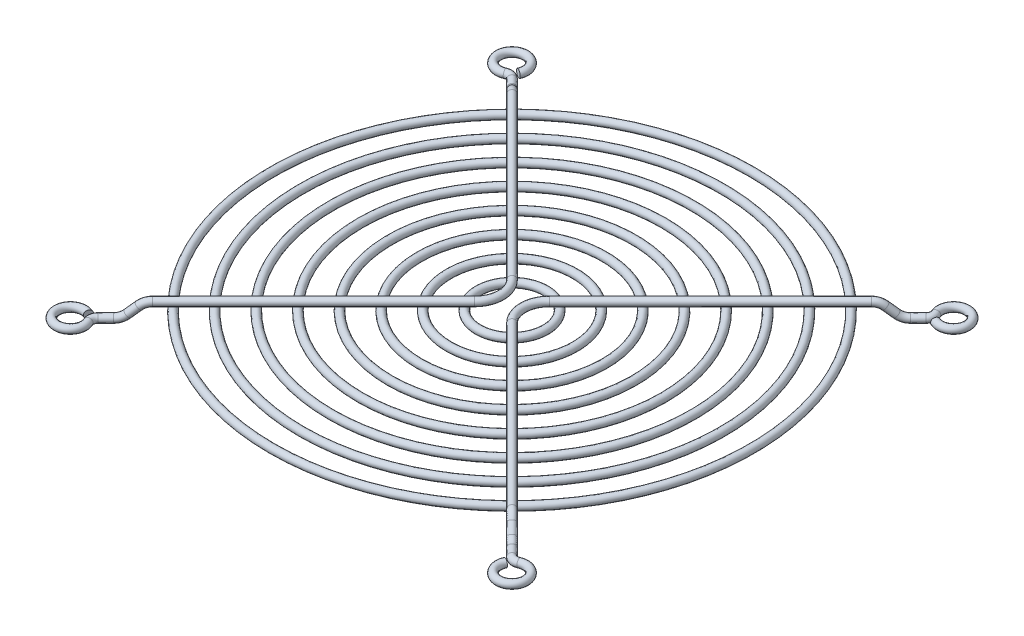
ISO-10303-21;
HEADER;
FILE_DESCRIPTION(('STEP AP214'),'2;1');
FILE_NAME('part.step','',(''),(''),'','','');
FILE_SCHEMA(('AUTOMOTIVE_DESIGN { 1 0 10303 214 1 1 1 1 }'));
ENDSEC;
DATA;
#1=APPLICATION_CONTEXT('core data for automotive mechanical design processes');
#2=APPLICATION_PROTOCOL_DEFINITION('international standard','automotive_design',2000,#1);
#3=PRODUCT_CONTEXT('',#1,'mechanical');
#4=PRODUCT('Part','Part','',(#3));
#5=PRODUCT_RELATED_PRODUCT_CATEGORY('part','',(#4));
#6=PRODUCT_DEFINITION_FORMATION('','',#4);
#7=PRODUCT_DEFINITION_CONTEXT('part definition',#1,'design');
#8=PRODUCT_DEFINITION('design','',#6,#7);
#9=PRODUCT_DEFINITION_SHAPE('','',#8);
#10=(LENGTH_UNIT() NAMED_UNIT(*) SI_UNIT(.MILLI.,.METRE.));
#11=(NAMED_UNIT(*) PLANE_ANGLE_UNIT() SI_UNIT($,.RADIAN.));
#12=(NAMED_UNIT(*) SI_UNIT($,.STERADIAN.) SOLID_ANGLE_UNIT());
#13=UNCERTAINTY_MEASURE_WITH_UNIT(LENGTH_MEASURE(1.E-05),#10,'distance_accuracy_value','');
#14=(GEOMETRIC_REPRESENTATION_CONTEXT(3) GLOBAL_UNCERTAINTY_ASSIGNED_CONTEXT((#13)) GLOBAL_UNIT_ASSIGNED_CONTEXT((#10,
#11,#12)) REPRESENTATION_CONTEXT('',''));
#15=CARTESIAN_POINT('',(0.,0.,0.));
#16=DIRECTION('',(0.,0.,1.));
#17=DIRECTION('',(1.,0.,0.));
#18=AXIS2_PLACEMENT_3D('',#15,#16,#17);
#19=CARTESIAN_POINT('',(4.43847763108502,4.6,4.43847763108508));
#20=DIRECTION('',(0.707106781186544,0.,0.707106781186551));
#21=DIRECTION('',(0.707106781186551,0.,-0.707106781186544));
#22=AXIS2_PLACEMENT_3D('',#19,#20,#21);
#23=CYLINDRICAL_SURFACE('',#22,0.9);
#24=CARTESIAN_POINT('',(4.43847763108502,4.6,4.43847763108508));
#25=DIRECTION('',(-0.707106781186542,0.,-0.707106781186553));
#26=DIRECTION('',(-0.707106781186553,0.,0.707106781186542));
#27=AXIS2_PLACEMENT_3D('',#24,#25,#26);
#28=CIRCLE('',#27,0.9);
#29=CARTESIAN_POINT('',(3.80208152801713,4.6,5.07487373415296));
#30=VERTEX_POINT('',#29);
#31=EDGE_CURVE('E11',#30,#30,#28,.T.);
#32=ORIENTED_EDGE('',*,*,#31,.F.);
#33=EDGE_LOOP('',(#32));
#34=FACE_BOUND('',#33,.T.);
#35=CARTESIAN_POINT('',(42.6385389055486,4.6,42.638538905549));
#36=DIRECTION('',(0.707106781186543,0.,0.707106781186552));
#37=DIRECTION('',(0.707106781186552,0.,-0.707106781186543));
#38=AXIS2_PLACEMENT_3D('',#35,#36,#37);
#39=CIRCLE('',#38,0.899999999999832);
#40=CARTESIAN_POINT('',(42.6385389055486,5.49999999999982,42.638538905549));
#41=VERTEX_POINT('',#40);
#42=EDGE_CURVE('E75',#41,#41,#39,.T.);
#43=ORIENTED_EDGE('',*,*,#42,.F.);
#44=EDGE_LOOP('',(#43));
#45=FACE_BOUND('',#44,.T.);
#46=ADVANCED_FACE('F50',(#34,#45),#23,.T.);
#47=CARTESIAN_POINT('',(47.3088311754566,4.8,47.3088311754571));
#48=DIRECTION('',(-0.707106781186546,0.,0.707106781186549));
#49=DIRECTION('',(0.707106781186549,0.,0.707106781186546));
#50=AXIS2_PLACEMENT_3D('',#47,#48,#49);
#51=TOROIDAL_SURFACE('',#50,3.60000000000001,0.899999999999832);
#52=CARTESIAN_POINT('',(45.6395705728697,2.08207099406508,45.6395705728702));
#53=DIRECTION('',(0.533851675244496,-0.655747495364855,0.533851675244505));
#54=DIRECTION('',(0.70710678118655,0.,-0.707106781186545));
#55=AXIS2_PLACEMENT_3D('',#52,#53,#54);
#56=CIRCLE('',#55,0.899999999999832);
#57=CARTESIAN_POINT('',(45.2222554222231,1.40258874258148,45.2222554222235));
#58=VERTEX_POINT('',#57);
#59=EDGE_CURVE('E63',#58,#58,#56,.T.);
#60=CARTESIAN_POINT('',(47.3088311754566,1.19999999999999,47.3088311754571));
#61=DIRECTION('',(0.707106781186544,0.,0.707106781186552));
#62=DIRECTION('',(0.707106781186552,0.,-0.707106781186543));
#63=AXIS2_PLACEMENT_3D('',#60,#61,#62);
#64=CIRCLE('',#63,0.899999999999832);
#65=CARTESIAN_POINT('',(47.3088311754566,0.300000000000154,47.308831175457));
#66=VERTEX_POINT('',#65);
#67=EDGE_CURVE('E57',#66,#66,#64,.T.);
#68=CARTESIAN_POINT('',(47.3088311754566,4.8,47.3088311754571));
#69=DIRECTION('',(-0.707106781186546,0.,0.707106781186549));
#70=DIRECTION('',(0.707106781186549,0.,0.707106781186546));
#71=AXIS2_PLACEMENT_3D('',#68,#69,#70);
#72=CIRCLE('',#71,4.49999999999984);
#73=EDGE_CURVE('',#58,#66,#72,.T.);
#74=ORIENTED_EDGE('',*,*,#59,.T.);
#75=ORIENTED_EDGE('',*,*,#67,.F.);
#76=ORIENTED_EDGE('',*,*,#73,.T.);
#77=ORIENTED_EDGE('',*,*,#73,.F.);
#78=EDGE_LOOP('',(#74,#76,#75,#77));
#79=FACE_BOUND('',#78,.T.);
#80=ADVANCED_FACE('F152',(#79),#51,.T.);
#81=CARTESIAN_POINT('',(44.3077995081355,3.71792900593494,44.3077995081359));
#82=DIRECTION('',(0.533851675244502,-0.655747495364855,0.533851675244499));
#83=DIRECTION('',(-0.775501949808318,-0.631345171711558,0.));
#84=AXIS2_PLACEMENT_3D('',#81,#82,#83);
#85=CYLINDRICAL_SURFACE('',#84,0.899999999999832);
#86=CARTESIAN_POINT('',(44.3077995081355,3.71792900593494,44.3077995081359));
#87=DIRECTION('',(0.533851675244496,-0.655747495364855,0.533851675244505));
#88=DIRECTION('',(0.70710678118655,0.,-0.707106781186545));
#89=AXIS2_PLACEMENT_3D('',#86,#87,#88);
#90=CIRCLE('',#89,0.899999999999832);
#91=CARTESIAN_POINT('',(44.7251146587821,4.39741125741854,44.7251146587826));
#92=VERTEX_POINT('',#91);
#93=EDGE_CURVE('E69',#92,#92,#90,.T.);
#94=ORIENTED_EDGE('',*,*,#93,.T.);
#95=EDGE_LOOP('',(#94));
#96=FACE_BOUND('',#95,.T.);
#97=ORIENTED_EDGE('',*,*,#59,.F.);
#98=EDGE_LOOP('',(#97));
#99=FACE_BOUND('',#98,.T.);
#100=ADVANCED_FACE('F157',(#96,#99),#85,.T.);
#101=CARTESIAN_POINT('',(42.6385389055486,1.,42.638538905549));
#102=DIRECTION('',(-0.707106781186546,0.,0.707106781186549));
#103=DIRECTION('',(0.707106781186549,0.,0.707106781186546));
#104=AXIS2_PLACEMENT_3D('',#101,#102,#103);
#105=TOROIDAL_SURFACE('',#104,3.59999999999999,0.899999999999832);
#106=CARTESIAN_POINT('',(42.6385389055486,1.,42.638538905549));
#107=DIRECTION('',(-0.707106781186546,0.,0.707106781186549));
#108=DIRECTION('',(0.707106781186549,0.,0.707106781186546));
#109=AXIS2_PLACEMENT_3D('',#106,#107,#108);
#110=CIRCLE('',#109,4.49999999999982);
#111=EDGE_CURVE('',#92,#41,#110,.T.);
#112=ORIENTED_EDGE('',*,*,#93,.F.);
#113=ORIENTED_EDGE('',*,*,#42,.T.);
#114=ORIENTED_EDGE('',*,*,#111,.T.);
#115=ORIENTED_EDGE('',*,*,#111,.F.);
#116=EDGE_LOOP('',(#112,#114,#113,#115));
#117=FACE_BOUND('',#116,.T.);
#118=ADVANCED_FACE('F162',(#117),#105,.T.);
#119=CARTESIAN_POINT('',(52.3999999999997,1.19999999999999,52.4000000000003));
#120=DIRECTION('',(0.,-1.,0.));
#121=DIRECTION('',(0.,0.,1.));
#122=AXIS2_PLACEMENT_3D('',#119,#120,#121);
#123=TOROIDAL_SURFACE('',#122,3.20000000000002,0.899999999999852);
#124=CARTESIAN_POINT('',(51.1035569316104,1.19999999999999,49.4743829077571));
#125=DIRECTION('',(0.914255341325991,0.,-0.405138458871651));
#126=DIRECTION('',(-0.405138458871651,0.,-0.914255341325991));
#127=AXIS2_PLACEMENT_3D('',#124,#125,#126);
#128=CIRCLE('',#127,0.899999999999852);
#129=CARTESIAN_POINT('',(50.738932318626,1.19999999999999,48.6515531005639));
#130=VERTEX_POINT('',#129);
#131=EDGE_CURVE('E83',#130,#130,#128,.T.);
#132=CARTESIAN_POINT('',(49.5070296734826,1.19999999999999,51.0322563508131));
#133=DIRECTION('',(0.427419890370996,0.,-0.904053227036576));
#134=DIRECTION('',(-0.904053227036576,0.,-0.427419890370996));
#135=AXIS2_PLACEMENT_3D('',#132,#133,#134);
#136=CIRCLE('',#135,0.899999999999852);
#137=CARTESIAN_POINT('',(48.6933817691499,1.19999999999999,50.6475784494793));
#138=VERTEX_POINT('',#137);
#139=EDGE_CURVE('E79',#138,#138,#136,.T.);
#140=CARTESIAN_POINT('',(52.3999999999997,1.19999999999999,52.4000000000003));
#141=DIRECTION('',(0.,-1.,0.));
#142=DIRECTION('',(0.,0.,1.));
#143=AXIS2_PLACEMENT_3D('',#140,#141,#142);
#144=CIRCLE('',#143,4.09999999999987);
#145=EDGE_CURVE('',#130,#138,#144,.T.);
#146=ORIENTED_EDGE('',*,*,#131,.T.);
#147=ORIENTED_EDGE('',*,*,#139,.F.);
#148=ORIENTED_EDGE('',*,*,#145,.T.);
#149=ORIENTED_EDGE('',*,*,#145,.F.);
#150=EDGE_LOOP('',(#146,#148,#147,#149));
#151=FACE_BOUND('',#150,.T.);
#152=ADVANCED_FACE('F164',(#151),#123,.T.);
#153=CARTESIAN_POINT('',(50.3743077056414,1.19999999999999,47.8287232933703));
#154=DIRECTION('',(0.,1.,0.));
#155=DIRECTION('',(0.,0.,-1.));
#156=AXIS2_PLACEMENT_3D('',#153,#154,#155);
#157=TOROIDAL_SURFACE('',#156,1.79999999999999,0.899999999999852);
#158=CARTESIAN_POINT('',(49.1015154995057,1.19999999999999,49.1015154995061));
#159=DIRECTION('',(0.707106781186544,0.,0.707106781186551));
#160=DIRECTION('',(0.707106781186551,0.,-0.707106781186544));
#161=AXIS2_PLACEMENT_3D('',#158,#159,#160);
#162=CIRCLE('',#161,0.899999999999852);
#163=CARTESIAN_POINT('',(49.7379116025735,1.19999999999999,48.4651193964383));
#164=VERTEX_POINT('',#163);
#165=EDGE_CURVE('E87',#164,#164,#162,.T.);
#166=ORIENTED_EDGE('',*,*,#165,.T.);
#167=EDGE_LOOP('',(#166));
#168=FACE_BOUND('',#167,.T.);
#169=ORIENTED_EDGE('',*,*,#131,.F.);
#170=EDGE_LOOP('',(#169));
#171=FACE_BOUND('',#170,.T.);
#172=ADVANCED_FACE('F171',(#168,#171),#157,.T.);
#173=CARTESIAN_POINT('',(49.1015154995057,1.19999999999999,49.1015154995061));
#174=DIRECTION('',(-0.707106781186542,0.,-0.707106781186553));
#175=DIRECTION('',(-0.707106781186553,0.,0.707106781186542));
#176=AXIS2_PLACEMENT_3D('',#173,#174,#175);
#177=CYLINDRICAL_SURFACE('',#176,0.899999999999852);
#178=ORIENTED_EDGE('',*,*,#165,.F.);
#179=EDGE_LOOP('',(#178));
#180=FACE_BOUND('',#179,.T.);
#181=ORIENTED_EDGE('',*,*,#67,.T.);
#182=EDGE_LOOP('',(#181));
#183=FACE_BOUND('',#182,.T.);
#184=ADVANCED_FACE('F180',(#180,#183),#177,.T.);
#185=CARTESIAN_POINT('',(49.5070296734826,1.19999999999999,51.0322563508131));
#186=DIRECTION('',(0.427419890370996,0.,-0.904053227036576));
#187=DIRECTION('',(-0.904053227036576,0.,-0.427419890370996));
#188=AXIS2_PLACEMENT_3D('',#185,#186,#187);
#189=PLANE('',#188);
#190=ORIENTED_EDGE('',*,*,#139,.T.);
#191=EDGE_LOOP('',(#190));
#192=FACE_BOUND('',#191,.T.);
#193=ADVANCED_FACE('F184',(#192),#189,.T.);
#194=CARTESIAN_POINT('',(8.87695526217015,4.6,0.));
#195=DIRECTION('',(0.,-1.,0.));
#196=DIRECTION('',(0.,0.,-1.));
#197=AXIS2_PLACEMENT_3D('',#194,#195,#196);
#198=TOROIDAL_SURFACE('',#197,6.27695526217015,0.899999999999991);
#199=CARTESIAN_POINT('',(4.43847763108503,4.6,-4.43847763108507));
#200=DIRECTION('',(-0.707106781186546,0.,0.707106781186549));
#201=DIRECTION('',(0.707106781186549,0.,0.707106781186546));
#202=AXIS2_PLACEMENT_3D('',#199,#200,#201);
#203=CIRCLE('',#202,0.9);
#204=CARTESIAN_POINT('',(3.80208152801714,4.6,-5.07487373415295));
#205=VERTEX_POINT('',#204);
#206=EDGE_CURVE('E91',#205,#205,#203,.T.);
#207=CARTESIAN_POINT('',(8.87695526217015,4.6,0.));
#208=DIRECTION('',(0.,-1.,0.));
#209=DIRECTION('',(0.,0.,-1.));
#210=AXIS2_PLACEMENT_3D('',#207,#208,#209);
#211=CIRCLE('',#210,7.17695526217015);
#212=EDGE_CURVE('',#30,#205,#211,.T.);
#213=ORIENTED_EDGE('',*,*,#31,.T.);
#214=ORIENTED_EDGE('',*,*,#206,.T.);
#215=ORIENTED_EDGE('',*,*,#212,.T.);
#216=ORIENTED_EDGE('',*,*,#212,.F.);
#217=EDGE_LOOP('',(#213,#215,#214,#216));
#218=FACE_BOUND('',#217,.T.);
#219=ADVANCED_FACE('F148',(#218),#198,.T.);
#220=CARTESIAN_POINT('',(4.43847763108503,4.6,-4.43847763108507));
#221=DIRECTION('',(0.707106781186544,0.,-0.707106781186551));
#222=DIRECTION('',(-0.707106781186551,0.,-0.707106781186544));
#223=AXIS2_PLACEMENT_3D('',#220,#221,#222);
#224=CYLINDRICAL_SURFACE('',#223,0.9);
#225=ORIENTED_EDGE('',*,*,#206,.F.);
#226=EDGE_LOOP('',(#225));
#227=FACE_BOUND('',#226,.T.);
#228=CARTESIAN_POINT('',(42.6385389055486,4.6,-42.638538905549));
#229=DIRECTION('',(0.707106781186544,0.,-0.707106781186551));
#230=DIRECTION('',(-0.707106781186551,0.,-0.707106781186544));
#231=AXIS2_PLACEMENT_3D('',#228,#229,#230);
#232=CIRCLE('',#231,0.899999999999832);
#233=CARTESIAN_POINT('',(42.6385389055486,5.49999999999982,-42.638538905549));
#234=VERTEX_POINT('',#233);
#235=EDGE_CURVE('E107',#234,#234,#232,.T.);
#236=ORIENTED_EDGE('',*,*,#235,.F.);
#237=EDGE_LOOP('',(#236));
#238=FACE_BOUND('',#237,.T.);
#239=ADVANCED_FACE('F138',(#227,#238),#224,.T.);
#240=CARTESIAN_POINT('',(47.3088311754566,4.8,-47.3088311754571));
#241=DIRECTION('',(0.707106781186556,0.,0.707106781186539));
#242=DIRECTION('',(0.707106781186539,0.,-0.707106781186556));
#243=AXIS2_PLACEMENT_3D('',#240,#241,#242);
#244=TOROIDAL_SURFACE('',#243,3.60000000000001,0.899999999999832);
#245=CARTESIAN_POINT('',(45.6395705728697,2.08207099406508,-45.6395705728702));
#246=DIRECTION('',(0.533851675244499,-0.655747495364855,-0.533851675244502));
#247=DIRECTION('',(-0.707106781186552,0.,-0.707106781186543));
#248=AXIS2_PLACEMENT_3D('',#245,#246,#247);
#249=CIRCLE('',#248,0.899999999999832);
#250=CARTESIAN_POINT('',(45.222255422223,1.40258874258148,-45.2222554222235));
#251=VERTEX_POINT('',#250);
#252=EDGE_CURVE('E99',#251,#251,#249,.T.);
#253=CARTESIAN_POINT('',(47.3088311754566,1.19999999999999,-47.3088311754571));
#254=DIRECTION('',(0.707106781186544,0.,-0.707106781186551));
#255=DIRECTION('',(-0.707106781186551,0.,-0.707106781186544));
#256=AXIS2_PLACEMENT_3D('',#253,#254,#255);
#257=CIRCLE('',#256,0.899999999999832);
#258=CARTESIAN_POINT('',(47.3088311754566,0.300000000000154,-47.3088311754571));
#259=VERTEX_POINT('',#258);
#260=EDGE_CURVE('E95',#259,#259,#257,.T.);
#261=CARTESIAN_POINT('',(47.3088311754566,4.8,-47.3088311754571));
#262=DIRECTION('',(0.707106781186556,0.,0.707106781186539));
#263=DIRECTION('',(0.707106781186539,0.,-0.707106781186556));
#264=AXIS2_PLACEMENT_3D('',#261,#262,#263);
#265=CIRCLE('',#264,4.49999999999984);
#266=EDGE_CURVE('',#251,#259,#265,.T.);
#267=ORIENTED_EDGE('',*,*,#252,.T.);
#268=ORIENTED_EDGE('',*,*,#260,.F.);
#269=ORIENTED_EDGE('',*,*,#266,.T.);
#270=ORIENTED_EDGE('',*,*,#266,.F.);
#271=EDGE_LOOP('',(#267,#269,#268,#270));
#272=FACE_BOUND('',#271,.T.);
#273=ADVANCED_FACE('F135',(#272),#244,.T.);
#274=CARTESIAN_POINT('',(44.3077995081355,3.71792900593494,-44.3077995081359));
#275=DIRECTION('',(0.533851675244494,-0.655747495364855,-0.533851675244508));
#276=DIRECTION('',(0.,-0.631345171711558,0.775501949808318));
#277=AXIS2_PLACEMENT_3D('',#274,#275,#276);
#278=CYLINDRICAL_SURFACE('',#277,0.899999999999832);
#279=CARTESIAN_POINT('',(44.3077995081355,3.71792900593494,-44.3077995081359));
#280=DIRECTION('',(0.533851675244499,-0.655747495364855,-0.533851675244502));
#281=DIRECTION('',(-0.707106781186552,0.,-0.707106781186543));
#282=AXIS2_PLACEMENT_3D('',#279,#280,#281);
#283=CIRCLE('',#282,0.899999999999832);
#284=CARTESIAN_POINT('',(44.7251146587821,4.39741125741854,-44.7251146587826));
#285=VERTEX_POINT('',#284);
#286=EDGE_CURVE('E103',#285,#285,#283,.T.);
#287=ORIENTED_EDGE('',*,*,#286,.T.);
#288=EDGE_LOOP('',(#287));
#289=FACE_BOUND('',#288,.T.);
#290=ORIENTED_EDGE('',*,*,#252,.F.);
#291=EDGE_LOOP('',(#290));
#292=FACE_BOUND('',#291,.T.);
#293=ADVANCED_FACE('F137',(#289,#292),#278,.T.);
#294=CARTESIAN_POINT('',(42.6385389055486,1.,-42.638538905549));
#295=DIRECTION('',(0.707106781186556,0.,0.707106781186539));
#296=DIRECTION('',(0.707106781186539,0.,-0.707106781186556));
#297=AXIS2_PLACEMENT_3D('',#294,#295,#296);
#298=TOROIDAL_SURFACE('',#297,3.59999999999999,0.899999999999832);
#299=CARTESIAN_POINT('',(42.6385389055486,1.,-42.638538905549));
#300=DIRECTION('',(0.707106781186556,0.,0.707106781186539));
#301=DIRECTION('',(0.707106781186539,0.,-0.707106781186556));
#302=AXIS2_PLACEMENT_3D('',#299,#300,#301);
#303=CIRCLE('',#302,4.49999999999982);
#304=EDGE_CURVE('',#285,#234,#303,.T.);
#305=ORIENTED_EDGE('',*,*,#286,.F.);
#306=ORIENTED_EDGE('',*,*,#235,.T.);
#307=ORIENTED_EDGE('',*,*,#304,.T.);
#308=ORIENTED_EDGE('',*,*,#304,.F.);
#309=EDGE_LOOP('',(#305,#307,#306,#308));
#310=FACE_BOUND('',#309,.T.);
#311=ADVANCED_FACE('F145',(#310),#298,.T.);
#312=CARTESIAN_POINT('',(52.3999999999997,1.19999999999999,-52.4000000000003));
#313=DIRECTION('',(0.,-1.,0.));
#314=DIRECTION('',(1.,0.,0.));
#315=AXIS2_PLACEMENT_3D('',#312,#313,#314);
#316=TOROIDAL_SURFACE('',#315,3.20000000000002,0.899999999999852);
#317=CARTESIAN_POINT('',(49.4743829077566,1.19999999999999,-51.1035569316109));
#318=DIRECTION('',(-0.405138458871661,0.,-0.914255341325986));
#319=DIRECTION('',(-0.914255341325986,0.,0.405138458871661));
#320=AXIS2_PLACEMENT_3D('',#317,#318,#319);
#321=CIRCLE('',#320,0.899999999999852);
#322=CARTESIAN_POINT('',(48.6515531005633,1.19999999999999,-50.7389323186265));
#323=VERTEX_POINT('',#322);
#324=EDGE_CURVE('E115',#323,#323,#321,.T.);
#325=CARTESIAN_POINT('',(51.0322563508126,1.19999999999999,-49.5070296734832));
#326=DIRECTION('',(-0.90405322703658,0.,-0.427419890370986));
#327=DIRECTION('',(-0.427419890370986,0.,0.90405322703658));
#328=AXIS2_PLACEMENT_3D('',#325,#326,#327);
#329=CIRCLE('',#328,0.899999999999852);
#330=CARTESIAN_POINT('',(50.6475784494788,1.19999999999999,-48.6933817691504));
#331=VERTEX_POINT('',#330);
#332=EDGE_CURVE('E111',#331,#331,#329,.T.);
#333=CARTESIAN_POINT('',(52.3999999999997,1.19999999999999,-52.4000000000003));
#334=DIRECTION('',(0.,-1.,0.));
#335=DIRECTION('',(1.,0.,0.));
#336=AXIS2_PLACEMENT_3D('',#333,#334,#335);
#337=CIRCLE('',#336,4.09999999999987);
#338=EDGE_CURVE('',#323,#331,#337,.T.);
#339=ORIENTED_EDGE('',*,*,#324,.T.);
#340=ORIENTED_EDGE('',*,*,#332,.F.);
#341=ORIENTED_EDGE('',*,*,#338,.T.);
#342=ORIENTED_EDGE('',*,*,#338,.F.);
#343=EDGE_LOOP('',(#339,#341,#340,#342));
#344=FACE_BOUND('',#343,.T.);
#345=ADVANCED_FACE('F198',(#344),#316,.T.);
#346=CARTESIAN_POINT('',(47.8287232933698,1.19999999999999,-50.3743077056419));
#347=DIRECTION('',(0.,1.,0.));
#348=DIRECTION('',(-1.,0.,0.));
#349=AXIS2_PLACEMENT_3D('',#346,#347,#348);
#350=TOROIDAL_SURFACE('',#349,1.79999999999999,0.899999999999852);
#351=CARTESIAN_POINT('',(49.1015154995056,1.19999999999999,-49.1015154995062));
#352=DIRECTION('',(0.707106781186544,0.,-0.707106781186551));
#353=DIRECTION('',(-0.707106781186551,0.,-0.707106781186544));
#354=AXIS2_PLACEMENT_3D('',#351,#352,#353);
#355=CIRCLE('',#354,0.899999999999852);
#356=CARTESIAN_POINT('',(48.4651193964378,1.19999999999999,-49.737911602574));
#357=VERTEX_POINT('',#356);
#358=EDGE_CURVE('E119',#357,#357,#355,.T.);
#359=ORIENTED_EDGE('',*,*,#358,.T.);
#360=EDGE_LOOP('',(#359));
#361=FACE_BOUND('',#360,.T.);
#362=ORIENTED_EDGE('',*,*,#324,.F.);
#363=EDGE_LOOP('',(#362));
#364=FACE_BOUND('',#363,.T.);
#365=ADVANCED_FACE('F125',(#361,#364),#350,.T.);
#366=CARTESIAN_POINT('',(49.1015154995056,1.19999999999999,-49.1015154995062));
#367=DIRECTION('',(-0.707106781186546,0.,0.707106781186549));
#368=DIRECTION('',(0.707106781186549,0.,0.707106781186546));
#369=AXIS2_PLACEMENT_3D('',#366,#367,#368);
#370=CYLINDRICAL_SURFACE('',#369,0.899999999999852);
#371=ORIENTED_EDGE('',*,*,#358,.F.);
#372=EDGE_LOOP('',(#371));
#373=FACE_BOUND('',#372,.T.);
#374=ORIENTED_EDGE('',*,*,#260,.T.);
#375=EDGE_LOOP('',(#374));
#376=FACE_BOUND('',#375,.T.);
#377=ADVANCED_FACE('F128',(#373,#376),#370,.T.);
#378=CARTESIAN_POINT('',(51.0322563508126,1.19999999999999,-49.5070296734832));
#379=DIRECTION('',(-0.90405322703658,0.,-0.427419890370986));
#380=DIRECTION('',(-0.427419890370986,0.,0.90405322703658));
#381=AXIS2_PLACEMENT_3D('',#378,#379,#380);
#382=PLANE('',#381);
#383=ORIENTED_EDGE('',*,*,#332,.T.);
#384=EDGE_LOOP('',(#383));
#385=FACE_BOUND('',#384,.T.);
#386=ADVANCED_FACE('F131',(#385),#382,.T.);
#387=CLOSED_SHELL('',(#46,#80,#100,#118,#152,#172,#184,#193,#219,#239,#273,#293,#311,#345,#365,
#377,#386));
#388=MANIFOLD_SOLID_BREP('B2',#387);
#389=CARTESIAN_POINT('',(-4.43847763108506,4.6,4.43847763108504));
#390=DIRECTION('',(-0.707106781186549,0.,0.707106781186546));
#391=DIRECTION('',(0.707106781186546,0.,0.707106781186549));
#392=AXIS2_PLACEMENT_3D('',#389,#390,#391);
#393=CYLINDRICAL_SURFACE('',#392,0.9);
#394=CARTESIAN_POINT('',(-4.43847763108506,4.6,4.43847763108504));
#395=DIRECTION('',(0.707106781186551,0.,-0.707106781186544));
#396=DIRECTION('',(-0.707106781186544,0.,-0.707106781186551));
#397=AXIS2_PLACEMENT_3D('',#394,#395,#396);
#398=CIRCLE('',#397,0.9);
#399=CARTESIAN_POINT('',(-3.80208152801718,4.6,5.07487373415293));
#400=VERTEX_POINT('',#399);
#401=EDGE_CURVE('E49',#400,#400,#398,.T.);
#402=ORIENTED_EDGE('',*,*,#401,.F.);
#403=EDGE_LOOP('',(#402));
#404=FACE_BOUND('',#403,.T.);
#405=CARTESIAN_POINT('',(-42.6385389055489,4.6,42.6385389055487));
#406=DIRECTION('',(-0.707106781186549,0.,0.707106781186546));
#407=DIRECTION('',(0.707106781186546,0.,0.707106781186549));
#408=AXIS2_PLACEMENT_3D('',#405,#406,#407);
#409=CIRCLE('',#408,0.899999999999832);
#410=CARTESIAN_POINT('',(-42.6385389055489,5.49999999999982,42.6385389055487));
#411=VERTEX_POINT('',#410);
#412=EDGE_CURVE('E364',#411,#411,#409,.T.);
#413=ORIENTED_EDGE('',*,*,#412,.F.);
#414=EDGE_LOOP('',(#413));
#415=FACE_BOUND('',#414,.T.);
#416=ADVANCED_FACE('F339',(#404,#415),#393,.T.);
#417=CARTESIAN_POINT('',(-47.3088311754569,4.8,47.3088311754568));
#418=DIRECTION('',(-0.707106781186551,0.,-0.707106781186544));
#419=DIRECTION('',(-0.707106781186544,0.,0.707106781186551));
#420=AXIS2_PLACEMENT_3D('',#417,#418,#419);
#421=TOROIDAL_SURFACE('',#420,3.60000000000001,0.899999999999832);
#422=CARTESIAN_POINT('',(-45.63957057287,2.08207099406508,45.6395705728699));
#423=DIRECTION('',(-0.533851675244503,-0.655747495364855,0.533851675244498));
#424=DIRECTION('',(0.707106781186547,0.,0.707106781186548));
#425=AXIS2_PLACEMENT_3D('',#422,#423,#424);
#426=CIRCLE('',#425,0.899999999999832);
#427=CARTESIAN_POINT('',(-45.2222554222233,1.40258874258148,45.2222554222232));
#428=VERTEX_POINT('',#427);
#429=EDGE_CURVE('E352',#428,#428,#426,.T.);
#430=CARTESIAN_POINT('',(-47.3088311754569,1.19999999999999,47.3088311754568));
#431=DIRECTION('',(-0.707106781186549,0.,0.707106781186546));
#432=DIRECTION('',(0.707106781186546,0.,0.707106781186549));
#433=AXIS2_PLACEMENT_3D('',#430,#431,#432);
#434=CIRCLE('',#433,0.899999999999832);
#435=CARTESIAN_POINT('',(-47.3088311754569,0.300000000000154,47.3088311754568));
#436=VERTEX_POINT('',#435);
#437=EDGE_CURVE('E346',#436,#436,#434,.T.);
#438=CARTESIAN_POINT('',(-47.3088311754569,4.8,47.3088311754568));
#439=DIRECTION('',(-0.707106781186551,0.,-0.707106781186544));
#440=DIRECTION('',(-0.707106781186544,0.,0.707106781186551));
#441=AXIS2_PLACEMENT_3D('',#438,#439,#440);
#442=CIRCLE('',#441,4.49999999999984);
#443=EDGE_CURVE('',#428,#436,#442,.T.);
#444=ORIENTED_EDGE('',*,*,#429,.T.);
#445=ORIENTED_EDGE('',*,*,#437,.F.);
#446=ORIENTED_EDGE('',*,*,#443,.T.);
#447=ORIENTED_EDGE('',*,*,#443,.F.);
#448=EDGE_LOOP('',(#444,#446,#445,#447));
#449=FACE_BOUND('',#448,.T.);
#450=ADVANCED_FACE('F441',(#449),#421,.T.);
#451=CARTESIAN_POINT('',(-44.3077995081358,3.71792900593494,44.3077995081356));
#452=DIRECTION('',(-0.533851675244498,-0.655747495364855,0.533851675244504));
#453=DIRECTION('',(0.,-0.631345171711558,-0.775501949808318));
#454=AXIS2_PLACEMENT_3D('',#451,#452,#453);
#455=CYLINDRICAL_SURFACE('',#454,0.899999999999832);
#456=CARTESIAN_POINT('',(-44.3077995081358,3.71792900593494,44.3077995081356));
#457=DIRECTION('',(-0.533851675244503,-0.655747495364855,0.533851675244498));
#458=DIRECTION('',(0.707106781186547,0.,0.707106781186548));
#459=AXIS2_PLACEMENT_3D('',#456,#457,#458);
#460=CIRCLE('',#459,0.899999999999832);
#461=CARTESIAN_POINT('',(-44.7251146587824,4.39741125741854,44.7251146587823));
#462=VERTEX_POINT('',#461);
#463=EDGE_CURVE('E358',#462,#462,#460,.T.);
#464=ORIENTED_EDGE('',*,*,#463,.T.);
#465=EDGE_LOOP('',(#464));
#466=FACE_BOUND('',#465,.T.);
#467=ORIENTED_EDGE('',*,*,#429,.F.);
#468=EDGE_LOOP('',(#467));
#469=FACE_BOUND('',#468,.T.);
#470=ADVANCED_FACE('F446',(#466,#469),#455,.T.);
#471=CARTESIAN_POINT('',(-42.6385389055489,1.,42.6385389055487));
#472=DIRECTION('',(-0.707106781186551,0.,-0.707106781186544));
#473=DIRECTION('',(-0.707106781186544,0.,0.707106781186551));
#474=AXIS2_PLACEMENT_3D('',#471,#472,#473);
#475=TOROIDAL_SURFACE('',#474,3.59999999999999,0.899999999999832);
#476=CARTESIAN_POINT('',(-42.6385389055489,1.,42.6385389055487));
#477=DIRECTION('',(-0.707106781186551,0.,-0.707106781186544));
#478=DIRECTION('',(-0.707106781186544,0.,0.707106781186551));
#479=AXIS2_PLACEMENT_3D('',#476,#477,#478);
#480=CIRCLE('',#479,4.49999999999982);
#481=EDGE_CURVE('',#462,#411,#480,.T.);
#482=ORIENTED_EDGE('',*,*,#463,.F.);
#483=ORIENTED_EDGE('',*,*,#412,.T.);
#484=ORIENTED_EDGE('',*,*,#481,.T.);
#485=ORIENTED_EDGE('',*,*,#481,.F.);
#486=EDGE_LOOP('',(#482,#484,#483,#485));
#487=FACE_BOUND('',#486,.T.);
#488=ADVANCED_FACE('F451',(#487),#475,.T.);
#489=CARTESIAN_POINT('',(-52.4000000000001,1.19999999999999,52.3999999999999));
#490=DIRECTION('',(0.,-1.,0.));
#491=DIRECTION('',(-1.,0.,0.));
#492=AXIS2_PLACEMENT_3D('',#489,#490,#491);
#493=TOROIDAL_SURFACE('',#492,3.20000000000002,0.899999999999852);
#494=CARTESIAN_POINT('',(-49.4743829077569,1.19999999999999,51.1035569316106));
#495=DIRECTION('',(0.405138458871654,0.,0.914255341325989));
#496=DIRECTION('',(0.914255341325989,0.,-0.405138458871654));
#497=AXIS2_PLACEMENT_3D('',#494,#495,#496);
#498=CIRCLE('',#497,0.899999999999852);
#499=CARTESIAN_POINT('',(-48.6515531005637,1.19999999999999,50.7389323186262));
#500=VERTEX_POINT('',#499);
#501=EDGE_CURVE('E372',#500,#500,#498,.T.);
#502=CARTESIAN_POINT('',(-51.0322563508129,1.19999999999999,49.5070296734828));
#503=DIRECTION('',(0.904053227036577,0.,0.427419890370993));
#504=DIRECTION('',(0.427419890370993,0.,-0.904053227036577));
#505=AXIS2_PLACEMENT_3D('',#502,#503,#504);
#506=CIRCLE('',#505,0.899999999999852);
#507=CARTESIAN_POINT('',(-50.6475784494791,1.19999999999999,48.69338176915));
#508=VERTEX_POINT('',#507);
#509=EDGE_CURVE('E368',#508,#508,#506,.T.);
#510=CARTESIAN_POINT('',(-52.4000000000001,1.19999999999999,52.3999999999999));
#511=DIRECTION('',(0.,-1.,0.));
#512=DIRECTION('',(-1.,0.,0.));
#513=AXIS2_PLACEMENT_3D('',#510,#511,#512);
#514=CIRCLE('',#513,4.09999999999987);
#515=EDGE_CURVE('',#500,#508,#514,.T.);
#516=ORIENTED_EDGE('',*,*,#501,.T.);
#517=ORIENTED_EDGE('',*,*,#509,.F.);
#518=ORIENTED_EDGE('',*,*,#515,.T.);
#519=ORIENTED_EDGE('',*,*,#515,.F.);
#520=EDGE_LOOP('',(#516,#518,#517,#519));
#521=FACE_BOUND('',#520,.T.);
#522=ADVANCED_FACE('F453',(#521),#493,.T.);
#523=CARTESIAN_POINT('',(-47.8287232933702,1.19999999999999,50.3743077056416));
#524=DIRECTION('',(0.,1.,0.));
#525=DIRECTION('',(1.,0.,0.));
#526=AXIS2_PLACEMENT_3D('',#523,#524,#525);
#527=TOROIDAL_SURFACE('',#526,1.79999999999999,0.899999999999852);
#528=CARTESIAN_POINT('',(-49.101515499506,1.19999999999999,49.1015154995058));
#529=DIRECTION('',(-0.707106781186549,0.,0.707106781186546));
#530=DIRECTION('',(0.707106781186546,0.,0.707106781186549));
#531=AXIS2_PLACEMENT_3D('',#528,#529,#530);
#532=CIRCLE('',#531,0.899999999999852);
#533=CARTESIAN_POINT('',(-48.4651193964382,1.19999999999999,49.7379116025736));
#534=VERTEX_POINT('',#533);
#535=EDGE_CURVE('E376',#534,#534,#532,.T.);
#536=ORIENTED_EDGE('',*,*,#535,.T.);
#537=EDGE_LOOP('',(#536));
#538=FACE_BOUND('',#537,.T.);
#539=ORIENTED_EDGE('',*,*,#501,.F.);
#540=EDGE_LOOP('',(#539));
#541=FACE_BOUND('',#540,.T.);
#542=ADVANCED_FACE('F460',(#538,#541),#527,.T.);
#543=CARTESIAN_POINT('',(-49.101515499506,1.19999999999999,49.1015154995058));
#544=DIRECTION('',(0.707106781186551,0.,-0.707106781186544));
#545=DIRECTION('',(-0.707106781186544,0.,-0.707106781186551));
#546=AXIS2_PLACEMENT_3D('',#543,#544,#545);
#547=CYLINDRICAL_SURFACE('',#546,0.899999999999852);
#548=ORIENTED_EDGE('',*,*,#535,.F.);
#549=EDGE_LOOP('',(#548));
#550=FACE_BOUND('',#549,.T.);
#551=ORIENTED_EDGE('',*,*,#437,.T.);
#552=EDGE_LOOP('',(#551));
#553=FACE_BOUND('',#552,.T.);
#554=ADVANCED_FACE('F469',(#550,#553),#547,.T.);
#555=CARTESIAN_POINT('',(-51.0322563508129,1.19999999999999,49.5070296734828));
#556=DIRECTION('',(0.904053227036577,0.,0.427419890370993));
#557=DIRECTION('',(0.427419890370993,0.,-0.904053227036577));
#558=AXIS2_PLACEMENT_3D('',#555,#556,#557);
#559=PLANE('',#558);
#560=ORIENTED_EDGE('',*,*,#509,.T.);
#561=EDGE_LOOP('',(#560));
#562=FACE_BOUND('',#561,.T.);
#563=ADVANCED_FACE('F473',(#562),#559,.T.);
#564=CARTESIAN_POINT('',(-8.87695526217014,4.6,0.));
#565=DIRECTION('',(0.,1.,0.));
#566=DIRECTION('',(0.,0.,1.));
#567=AXIS2_PLACEMENT_3D('',#564,#565,#566);
#568=TOROIDAL_SURFACE('',#567,6.27695526217012,0.89999999999999);
#569=CARTESIAN_POINT('',(-4.43847763108502,4.6,-4.43847763108508));
#570=DIRECTION('',(0.707106781186542,0.,0.707106781186553));
#571=DIRECTION('',(0.707106781186553,0.,-0.707106781186542));
#572=AXIS2_PLACEMENT_3D('',#569,#570,#571);
#573=CIRCLE('',#572,0.9);
#574=CARTESIAN_POINT('',(-3.80208152801713,4.6,-5.07487373415296));
#575=VERTEX_POINT('',#574);
#576=EDGE_CURVE('E380',#575,#575,#573,.T.);
#577=CARTESIAN_POINT('',(-8.87695526217014,4.6,0.));
#578=DIRECTION('',(0.,1.,0.));
#579=DIRECTION('',(0.,0.,1.));
#580=AXIS2_PLACEMENT_3D('',#577,#578,#579);
#581=CIRCLE('',#580,7.17695526217011);
#582=EDGE_CURVE('',#400,#575,#581,.T.);
#583=ORIENTED_EDGE('',*,*,#401,.T.);
#584=ORIENTED_EDGE('',*,*,#576,.T.);
#585=ORIENTED_EDGE('',*,*,#582,.T.);
#586=ORIENTED_EDGE('',*,*,#582,.F.);
#587=EDGE_LOOP('',(#583,#585,#584,#586));
#588=FACE_BOUND('',#587,.T.);
#589=ADVANCED_FACE('F437',(#588),#568,.T.);
#590=CARTESIAN_POINT('',(-4.43847763108502,4.6,-4.43847763108508));
#591=DIRECTION('',(-0.707106781186544,0.,-0.707106781186551));
#592=DIRECTION('',(-0.707106781186551,0.,0.707106781186544));
#593=AXIS2_PLACEMENT_3D('',#590,#591,#592);
#594=CYLINDRICAL_SURFACE('',#593,0.9);
#595=ORIENTED_EDGE('',*,*,#576,.F.);
#596=EDGE_LOOP('',(#595));
#597=FACE_BOUND('',#596,.T.);
#598=CARTESIAN_POINT('',(-42.6385389055486,4.6,-42.638538905549));
#599=DIRECTION('',(-0.707106781186543,0.,-0.707106781186552));
#600=DIRECTION('',(-0.707106781186552,0.,0.707106781186543));
#601=AXIS2_PLACEMENT_3D('',#598,#599,#600);
#602=CIRCLE('',#601,0.899999999999832);
#603=CARTESIAN_POINT('',(-42.6385389055486,5.49999999999982,-42.638538905549));
#604=VERTEX_POINT('',#603);
#605=EDGE_CURVE('E396',#604,#604,#602,.T.);
#606=ORIENTED_EDGE('',*,*,#605,.F.);
#607=EDGE_LOOP('',(#606));
#608=FACE_BOUND('',#607,.T.);
#609=ADVANCED_FACE('F427',(#597,#608),#594,.T.);
#610=CARTESIAN_POINT('',(-47.3088311754566,4.8,-47.3088311754571));
#611=DIRECTION('',(0.707106781186546,0.,-0.707106781186549));
#612=DIRECTION('',(-0.707106781186549,0.,-0.707106781186546));
#613=AXIS2_PLACEMENT_3D('',#610,#611,#612);
#614=TOROIDAL_SURFACE('',#613,3.60000000000001,0.899999999999832);
#615=CARTESIAN_POINT('',(-45.6395705728697,2.08207099406508,-45.6395705728702));
#616=DIRECTION('',(-0.533851675244496,-0.655747495364855,-0.533851675244505));
#617=DIRECTION('',(-0.70710678118655,0.,0.707106781186545));
#618=AXIS2_PLACEMENT_3D('',#615,#616,#617);
#619=CIRCLE('',#618,0.899999999999832);
#620=CARTESIAN_POINT('',(-45.2222554222231,1.40258874258148,-45.2222554222235));
#621=VERTEX_POINT('',#620);
#622=EDGE_CURVE('E388',#621,#621,#619,.T.);
#623=CARTESIAN_POINT('',(-47.3088311754566,1.19999999999999,-47.3088311754571));
#624=DIRECTION('',(-0.707106781186544,0.,-0.707106781186552));
#625=DIRECTION('',(-0.707106781186552,0.,0.707106781186543));
#626=AXIS2_PLACEMENT_3D('',#623,#624,#625);
#627=CIRCLE('',#626,0.899999999999832);
#628=CARTESIAN_POINT('',(-47.3088311754566,0.300000000000154,-47.308831175457));
#629=VERTEX_POINT('',#628);
#630=EDGE_CURVE('E384',#629,#629,#627,.T.);
#631=CARTESIAN_POINT('',(-47.3088311754566,4.8,-47.3088311754571));
#632=DIRECTION('',(0.707106781186546,0.,-0.707106781186549));
#633=DIRECTION('',(-0.707106781186549,0.,-0.707106781186546));
#634=AXIS2_PLACEMENT_3D('',#631,#632,#633);
#635=CIRCLE('',#634,4.49999999999984);
#636=EDGE_CURVE('',#621,#629,#635,.T.);
#637=ORIENTED_EDGE('',*,*,#622,.T.);
#638=ORIENTED_EDGE('',*,*,#630,.F.);
#639=ORIENTED_EDGE('',*,*,#636,.T.);
#640=ORIENTED_EDGE('',*,*,#636,.F.);
#641=EDGE_LOOP('',(#637,#639,#638,#640));
#642=FACE_BOUND('',#641,.T.);
#643=ADVANCED_FACE('F424',(#642),#614,.T.);
#644=CARTESIAN_POINT('',(-44.3077995081355,3.71792900593494,-44.3077995081359));
#645=DIRECTION('',(-0.533851675244502,-0.655747495364855,-0.533851675244499));
#646=DIRECTION('',(0.775501949808318,-0.631345171711558,0.));
#647=AXIS2_PLACEMENT_3D('',#644,#645,#646);
#648=CYLINDRICAL_SURFACE('',#647,0.899999999999832);
#649=CARTESIAN_POINT('',(-44.3077995081355,3.71792900593494,-44.3077995081359));
#650=DIRECTION('',(-0.533851675244496,-0.655747495364855,-0.533851675244505));
#651=DIRECTION('',(-0.70710678118655,0.,0.707106781186545));
#652=AXIS2_PLACEMENT_3D('',#649,#650,#651);
#653=CIRCLE('',#652,0.899999999999832);
#654=CARTESIAN_POINT('',(-44.7251146587821,4.39741125741854,-44.7251146587826));
#655=VERTEX_POINT('',#654);
#656=EDGE_CURVE('E392',#655,#655,#653,.T.);
#657=ORIENTED_EDGE('',*,*,#656,.T.);
#658=EDGE_LOOP('',(#657));
#659=FACE_BOUND('',#658,.T.);
#660=ORIENTED_EDGE('',*,*,#622,.F.);
#661=EDGE_LOOP('',(#660));
#662=FACE_BOUND('',#661,.T.);
#663=ADVANCED_FACE('F426',(#659,#662),#648,.T.);
#664=CARTESIAN_POINT('',(-42.6385389055486,1.,-42.638538905549));
#665=DIRECTION('',(0.707106781186546,0.,-0.707106781186549));
#666=DIRECTION('',(-0.707106781186549,0.,-0.707106781186546));
#667=AXIS2_PLACEMENT_3D('',#664,#665,#666);
#668=TOROIDAL_SURFACE('',#667,3.59999999999999,0.899999999999832);
#669=CARTESIAN_POINT('',(-42.6385389055486,1.,-42.638538905549));
#670=DIRECTION('',(0.707106781186546,0.,-0.707106781186549));
#671=DIRECTION('',(-0.707106781186549,0.,-0.707106781186546));
#672=AXIS2_PLACEMENT_3D('',#669,#670,#671);
#673=CIRCLE('',#672,4.49999999999982);
#674=EDGE_CURVE('',#655,#604,#673,.T.);
#675=ORIENTED_EDGE('',*,*,#656,.F.);
#676=ORIENTED_EDGE('',*,*,#605,.T.);
#677=ORIENTED_EDGE('',*,*,#674,.T.);
#678=ORIENTED_EDGE('',*,*,#674,.F.);
#679=EDGE_LOOP('',(#675,#677,#676,#678));
#680=FACE_BOUND('',#679,.T.);
#681=ADVANCED_FACE('F434',(#680),#668,.T.);
#682=CARTESIAN_POINT('',(-52.3999999999997,1.19999999999999,-52.4000000000003));
#683=DIRECTION('',(0.,-1.,0.));
#684=DIRECTION('',(0.,0.,-1.));
#685=AXIS2_PLACEMENT_3D('',#682,#683,#684);
#686=TOROIDAL_SURFACE('',#685,3.20000000000002,0.899999999999852);
#687=CARTESIAN_POINT('',(-51.1035569316104,1.19999999999999,-49.4743829077571));
#688=DIRECTION('',(-0.914255341325991,0.,0.405138458871651));
#689=DIRECTION('',(0.405138458871651,0.,0.914255341325991));
#690=AXIS2_PLACEMENT_3D('',#687,#688,#689);
#691=CIRCLE('',#690,0.899999999999852);
#692=CARTESIAN_POINT('',(-50.738932318626,1.19999999999999,-48.6515531005639));
#693=VERTEX_POINT('',#692);
#694=EDGE_CURVE('E404',#693,#693,#691,.T.);
#695=CARTESIAN_POINT('',(-49.5070296734826,1.19999999999999,-51.0322563508131));
#696=DIRECTION('',(-0.427419890370996,0.,0.904053227036576));
#697=DIRECTION('',(0.904053227036576,0.,0.427419890370996));
#698=AXIS2_PLACEMENT_3D('',#695,#696,#697);
#699=CIRCLE('',#698,0.899999999999852);
#700=CARTESIAN_POINT('',(-48.6933817691499,1.19999999999999,-50.6475784494793));
#701=VERTEX_POINT('',#700);
#702=EDGE_CURVE('E400',#701,#701,#699,.T.);
#703=CARTESIAN_POINT('',(-52.3999999999997,1.19999999999999,-52.4000000000003));
#704=DIRECTION('',(0.,-1.,0.));
#705=DIRECTION('',(0.,0.,-1.));
#706=AXIS2_PLACEMENT_3D('',#703,#704,#705);
#707=CIRCLE('',#706,4.09999999999987);
#708=EDGE_CURVE('',#693,#701,#707,.T.);
#709=ORIENTED_EDGE('',*,*,#694,.T.);
#710=ORIENTED_EDGE('',*,*,#702,.F.);
#711=ORIENTED_EDGE('',*,*,#708,.T.);
#712=ORIENTED_EDGE('',*,*,#708,.F.);
#713=EDGE_LOOP('',(#709,#711,#710,#712));
#714=FACE_BOUND('',#713,.T.);
#715=ADVANCED_FACE('F487',(#714),#686,.T.);
#716=CARTESIAN_POINT('',(-50.3743077056414,1.19999999999999,-47.8287232933703));
#717=DIRECTION('',(0.,1.,0.));
#718=DIRECTION('',(0.,0.,1.));
#719=AXIS2_PLACEMENT_3D('',#716,#717,#718);
#720=TOROIDAL_SURFACE('',#719,1.79999999999999,0.899999999999852);
#721=CARTESIAN_POINT('',(-49.1015154995057,1.19999999999999,-49.1015154995061));
#722=DIRECTION('',(-0.707106781186544,0.,-0.707106781186551));
#723=DIRECTION('',(-0.707106781186551,0.,0.707106781186544));
#724=AXIS2_PLACEMENT_3D('',#721,#722,#723);
#725=CIRCLE('',#724,0.899999999999852);
#726=CARTESIAN_POINT('',(-49.7379116025735,1.19999999999999,-48.4651193964383));
#727=VERTEX_POINT('',#726);
#728=EDGE_CURVE('E408',#727,#727,#725,.T.);
#729=ORIENTED_EDGE('',*,*,#728,.T.);
#730=EDGE_LOOP('',(#729));
#731=FACE_BOUND('',#730,.T.);
#732=ORIENTED_EDGE('',*,*,#694,.F.);
#733=EDGE_LOOP('',(#732));
#734=FACE_BOUND('',#733,.T.);
#735=ADVANCED_FACE('F414',(#731,#734),#720,.T.);
#736=CARTESIAN_POINT('',(-49.1015154995057,1.19999999999999,-49.1015154995061));
#737=DIRECTION('',(0.707106781186542,0.,0.707106781186553));
#738=DIRECTION('',(0.707106781186553,0.,-0.707106781186542));
#739=AXIS2_PLACEMENT_3D('',#736,#737,#738);
#740=CYLINDRICAL_SURFACE('',#739,0.899999999999852);
#741=ORIENTED_EDGE('',*,*,#728,.F.);
#742=EDGE_LOOP('',(#741));
#743=FACE_BOUND('',#742,.T.);
#744=ORIENTED_EDGE('',*,*,#630,.T.);
#745=EDGE_LOOP('',(#744));
#746=FACE_BOUND('',#745,.T.);
#747=ADVANCED_FACE('F417',(#743,#746),#740,.T.);
#748=CARTESIAN_POINT('',(-49.5070296734826,1.19999999999999,-51.0322563508131));
#749=DIRECTION('',(-0.427419890370996,0.,0.904053227036576));
#750=DIRECTION('',(0.904053227036576,0.,0.427419890370996));
#751=AXIS2_PLACEMENT_3D('',#748,#749,#750);
#752=PLANE('',#751);
#753=ORIENTED_EDGE('',*,*,#702,.T.);
#754=EDGE_LOOP('',(#753));
#755=FACE_BOUND('',#754,.T.);
#756=ADVANCED_FACE('F420',(#755),#752,.T.);
#757=CLOSED_SHELL('',(#416,#450,#470,#488,#522,#542,#554,#563,#589,#609,#643,#663,#681,#715,
#735,#747,#756));
#758=MANIFOLD_SOLID_BREP('B6',#757);
#759=CARTESIAN_POINT('',(0.,2.8,0.));
#760=DIRECTION('',(0.,1.,0.));
#761=DIRECTION('',(0.,0.,1.));
#762=AXIS2_PLACEMENT_3D('',#759,#760,#761);
#763=TOROIDAL_SURFACE('',#762,14.9857142857143,0.9);
#764=CARTESIAN_POINT('',(0.,2.8,15.8857142857143));
#765=VERTEX_POINT('',#764);
#766=VERTEX_LOOP('',#765);
#767=FACE_BOUND('',#766,.T.);
#768=ADVANCED_FACE('F628',(#767),#763,.T.);
#769=CLOSED_SHELL('',(#768));
#770=MANIFOLD_SOLID_BREP('B44',#769);
#771=CARTESIAN_POINT('',(0.,2.8,0.));
#772=DIRECTION('',(0.,1.,0.));
#773=DIRECTION('',(0.,0.,1.));
#774=AXIS2_PLACEMENT_3D('',#771,#772,#773);
#775=TOROIDAL_SURFACE('',#774,21.9714285714286,0.9);
#776=CARTESIAN_POINT('',(0.,2.8,22.8714285714286));
#777=VERTEX_POINT('',#776);
#778=VERTEX_LOOP('',#777);
#779=FACE_BOUND('',#778,.T.);
#780=ADVANCED_FACE('F647',(#779),#775,.T.);
#781=CLOSED_SHELL('',(#780));
#782=MANIFOLD_SOLID_BREP('B335',#781);
#783=CARTESIAN_POINT('',(0.,2.8,0.));
#784=DIRECTION('',(0.,1.,0.));
#785=DIRECTION('',(0.,0.,1.));
#786=AXIS2_PLACEMENT_3D('',#783,#784,#785);
#787=TOROIDAL_SURFACE('',#786,28.9571428571429,0.9);
#788=CARTESIAN_POINT('',(0.,2.8,29.8571428571429));
#789=VERTEX_POINT('',#788);
#790=VERTEX_LOOP('',#789);
#791=FACE_BOUND('',#790,.T.);
#792=ADVANCED_FACE('F666',(#791),#787,.T.);
#793=CLOSED_SHELL('',(#792));
#794=MANIFOLD_SOLID_BREP('B624',#793);
#795=CARTESIAN_POINT('',(0.,2.8,0.));
#796=DIRECTION('',(0.,1.,0.));
#797=DIRECTION('',(0.,0.,1.));
#798=AXIS2_PLACEMENT_3D('',#795,#796,#797);
#799=TOROIDAL_SURFACE('',#798,35.9428571428571,0.899999999999997);
#800=CARTESIAN_POINT('',(0.,2.8,36.8428571428571));
#801=VERTEX_POINT('',#800);
#802=VERTEX_LOOP('',#801);
#803=FACE_BOUND('',#802,.T.);
#804=ADVANCED_FACE('F685',(#803),#799,.T.);
#805=CLOSED_SHELL('',(#804));
#806=MANIFOLD_SOLID_BREP('B643',#805);
#807=CARTESIAN_POINT('',(0.,2.8,0.));
#808=DIRECTION('',(0.,1.,0.));
#809=DIRECTION('',(0.,0.,1.));
#810=AXIS2_PLACEMENT_3D('',#807,#808,#809);
#811=TOROIDAL_SURFACE('',#810,42.9285714285714,0.899999999999997);
#812=CARTESIAN_POINT('',(0.,2.8,43.8285714285714));
#813=VERTEX_POINT('',#812);
#814=VERTEX_LOOP('',#813);
#815=FACE_BOUND('',#814,.T.);
#816=ADVANCED_FACE('F704',(#815),#811,.T.);
#817=CLOSED_SHELL('',(#816));
#818=MANIFOLD_SOLID_BREP('B662',#817);
#819=CARTESIAN_POINT('',(0.,2.8,0.));
#820=DIRECTION('',(0.,1.,0.));
#821=DIRECTION('',(0.,0.,1.));
#822=AXIS2_PLACEMENT_3D('',#819,#820,#821);
#823=TOROIDAL_SURFACE('',#822,49.9142857142857,0.899999999999997);
#824=CARTESIAN_POINT('',(0.,2.8,50.8142857142857));
#825=VERTEX_POINT('',#824);
#826=VERTEX_LOOP('',#825);
#827=FACE_BOUND('',#826,.T.);
#828=ADVANCED_FACE('F723',(#827),#823,.T.);
#829=CLOSED_SHELL('',(#828));
#830=MANIFOLD_SOLID_BREP('B681',#829);
#831=CARTESIAN_POINT('',(0.,2.80000000000001,0.));
#832=DIRECTION('',(0.,1.,0.));
#833=DIRECTION('',(0.,0.,1.));
#834=AXIS2_PLACEMENT_3D('',#831,#832,#833);
#835=TOROIDAL_SURFACE('',#834,56.9,0.899999999999997);
#836=CARTESIAN_POINT('',(0.,2.80000000000001,57.8));
#837=VERTEX_POINT('',#836);
#838=VERTEX_LOOP('',#837);
#839=FACE_BOUND('',#838,.T.);
#840=ADVANCED_FACE('F741',(#839),#835,.T.);
#841=CLOSED_SHELL('',(#840));
#842=MANIFOLD_SOLID_BREP('B700',#841);
#843=CARTESIAN_POINT('',(0.,2.8,0.));
#844=DIRECTION('',(0.,1.,0.));
#845=DIRECTION('',(0.,0.,1.));
#846=AXIS2_PLACEMENT_3D('',#843,#844,#845);
#847=TOROIDAL_SURFACE('',#846,8.,0.9);
#848=CARTESIAN_POINT('',(0.,2.8,8.9));
#849=VERTEX_POINT('',#848);
#850=VERTEX_LOOP('',#849);
#851=FACE_BOUND('',#850,.T.);
#852=ADVANCED_FACE('F754',(#851),#847,.T.);
#853=CLOSED_SHELL('',(#852));
#854=MANIFOLD_SOLID_BREP('B719',#853);
#855=ADVANCED_BREP_SHAPE_REPRESENTATION('',(#18,#388,#758,#770,#782,#794,#806,#818,#830,#842,
#854),#14);
#856=SHAPE_DEFINITION_REPRESENTATION(#9,#855);
ENDSEC;
END-ISO-10303-21;
